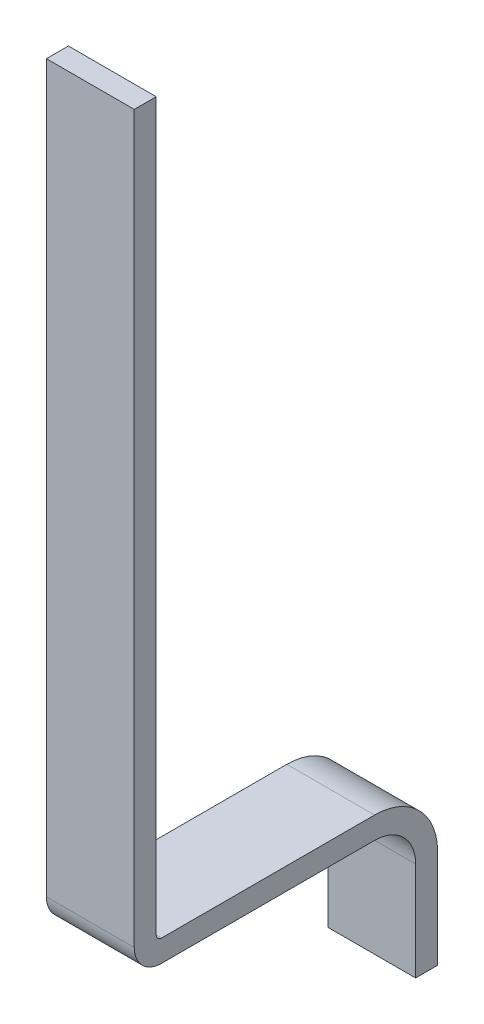
ISO-10303-21;
HEADER;
FILE_DESCRIPTION(('STEP AP214'),'2;1');
FILE_NAME('part.step','',(''),(''),'','','');
FILE_SCHEMA(('AUTOMOTIVE_DESIGN { 1 0 10303 214 1 1 1 1 }'));
ENDSEC;
DATA;
#1=APPLICATION_CONTEXT('core data for automotive mechanical design processes');
#2=APPLICATION_PROTOCOL_DEFINITION('international standard','automotive_design',2000,#1);
#3=PRODUCT_CONTEXT('',#1,'mechanical');
#4=PRODUCT('Part','Part','',(#3));
#5=PRODUCT_RELATED_PRODUCT_CATEGORY('part','',(#4));
#6=PRODUCT_DEFINITION_FORMATION('','',#4);
#7=PRODUCT_DEFINITION_CONTEXT('part definition',#1,'design');
#8=PRODUCT_DEFINITION('design','',#6,#7);
#9=PRODUCT_DEFINITION_SHAPE('','',#8);
#10=(LENGTH_UNIT() NAMED_UNIT(*) SI_UNIT(.MILLI.,.METRE.));
#11=(NAMED_UNIT(*) PLANE_ANGLE_UNIT() SI_UNIT($,.RADIAN.));
#12=(NAMED_UNIT(*) SI_UNIT($,.STERADIAN.) SOLID_ANGLE_UNIT());
#13=UNCERTAINTY_MEASURE_WITH_UNIT(LENGTH_MEASURE(1.E-05),#10,'distance_accuracy_value','');
#14=(GEOMETRIC_REPRESENTATION_CONTEXT(3) GLOBAL_UNCERTAINTY_ASSIGNED_CONTEXT((#13)) GLOBAL_UNIT_ASSIGNED_CONTEXT((#10,
#11,#12)) REPRESENTATION_CONTEXT('',''));
#15=CARTESIAN_POINT('',(0.,0.,0.));
#16=DIRECTION('',(0.,0.,1.));
#17=DIRECTION('',(1.,0.,0.));
#18=AXIS2_PLACEMENT_3D('',#15,#16,#17);
#19=CARTESIAN_POINT('',(0.4,-0.824102749111,-0.09602584583165));
#20=DIRECTION('',(1.,0.,0.));
#21=DIRECTION('',(0.,-1.,0.));
#22=AXIS2_PLACEMENT_3D('',#19,#20,#21);
#23=PLANE('',#22);
#24=DIRECTION('',(0.,1.,0.));
#25=VECTOR('',#24,1.);
#26=CARTESIAN_POINT('',(0.4,-1.805851747482,0.16));
#27=LINE('',#26,#25);
#28=CARTESIAN_POINT('',(0.4,-1.805851747482,0.16));
#29=VERTEX_POINT('',#28);
#30=CARTESIAN_POINT('',(0.4,1.5,0.16));
#31=VERTEX_POINT('',#30);
#32=EDGE_CURVE('E194',#29,#31,#27,.T.);
#33=ORIENTED_EDGE('',*,*,#32,.T.);
#34=DIRECTION('',(0.,0.,1.));
#35=VECTOR('',#34,1.);
#36=CARTESIAN_POINT('',(0.4,1.5,0.16));
#37=LINE('',#36,#35);
#38=CARTESIAN_POINT('',(0.4,1.5,0.26));
#39=VERTEX_POINT('',#38);
#40=EDGE_CURVE('E246',#31,#39,#37,.T.);
#41=ORIENTED_EDGE('',*,*,#40,.T.);
#42=DIRECTION('',(0.,-1.,0.));
#43=VECTOR('',#42,1.);
#44=CARTESIAN_POINT('',(0.4,1.5,0.26));
#45=LINE('',#44,#43);
#46=CARTESIAN_POINT('',(0.4,-1.805851747482,0.26));
#47=VERTEX_POINT('',#46);
#48=EDGE_CURVE('E217',#39,#47,#45,.T.);
#49=ORIENTED_EDGE('',*,*,#48,.T.);
#50=CARTESIAN_POINT('',(0.4,-1.805851747482,0.135287023696));
#51=DIRECTION('',(1.,0.,0.));
#52=DIRECTION('',(0.,1.,0.));
#53=AXIS2_PLACEMENT_3D('',#50,#51,#52);
#54=CIRCLE('',#53,0.124712976304);
#55=CARTESIAN_POINT('',(0.4,-1.930564723786,0.135287023696));
#56=VERTEX_POINT('',#55);
#57=EDGE_CURVE('E242',#47,#56,#54,.T.);
#58=ORIENTED_EDGE('',*,*,#57,.T.);
#59=DIRECTION('',(0.,0.,-1.));
#60=VECTOR('',#59,1.);
#61=CARTESIAN_POINT('',(0.4,-1.930564723786,0.135287023696));
#62=LINE('',#61,#60);
#63=CARTESIAN_POINT('',(0.4,-1.930564723786,-0.834763344159));
#64=VERTEX_POINT('',#63);
#65=EDGE_CURVE('E229',#56,#64,#62,.T.);
#66=ORIENTED_EDGE('',*,*,#65,.T.);
#67=CARTESIAN_POINT('',(0.4,-2.117351316963,-0.834763344159));
#68=DIRECTION('',(1.,0.,0.));
#69=DIRECTION('',(0.,1.,0.));
#70=AXIS2_PLACEMENT_3D('',#67,#68,#69);
#71=CIRCLE('',#70,0.186786593177);
#72=CARTESIAN_POINT('',(0.4,-2.117351316963,-1.021549937336));
#73=VERTEX_POINT('',#72);
#74=EDGE_CURVE('E215',#73,#64,#71,.T.);
#75=ORIENTED_EDGE('',*,*,#74,.F.);
#76=DIRECTION('',(0.,-1.,0.));
#77=VECTOR('',#76,1.);
#78=CARTESIAN_POINT('',(0.4,-2.117351316963,-1.021549937336));
#79=LINE('',#78,#77);
#80=CARTESIAN_POINT('',(0.4,-2.566872544918,-1.021549937336));
#81=VERTEX_POINT('',#80);
#82=EDGE_CURVE('E144',#73,#81,#79,.T.);
#83=ORIENTED_EDGE('',*,*,#82,.T.);
#84=DIRECTION('',(0.,0.,-1.));
#85=VECTOR('',#84,1.);
#86=CARTESIAN_POINT('',(0.4,-2.566872544918,-1.021549937336));
#87=LINE('',#86,#85);
#88=CARTESIAN_POINT('',(0.4,-2.566872544918,-1.121549937336));
#89=VERTEX_POINT('',#88);
#90=EDGE_CURVE('E140',#81,#89,#87,.T.);
#91=ORIENTED_EDGE('',*,*,#90,.T.);
#92=DIRECTION('',(0.,1.,0.));
#93=VECTOR('',#92,1.);
#94=CARTESIAN_POINT('',(0.4,-2.566872544918,-1.121549937336));
#95=LINE('',#94,#93);
#96=CARTESIAN_POINT('',(0.4,-2.117351316963,-1.121549937336));
#97=VERTEX_POINT('',#96);
#98=EDGE_CURVE('E127',#89,#97,#95,.T.);
#99=ORIENTED_EDGE('',*,*,#98,.T.);
#100=CARTESIAN_POINT('',(0.4,-2.117351316963,-0.834763344159));
#101=DIRECTION('',(1.,0.,0.));
#102=DIRECTION('',(0.,1.,0.));
#103=AXIS2_PLACEMENT_3D('',#100,#101,#102);
#104=CIRCLE('',#103,0.286786593177);
#105=CARTESIAN_POINT('',(0.4,-1.830564723786,-0.834763344159));
#106=VERTEX_POINT('',#105);
#107=EDGE_CURVE('E170',#97,#106,#104,.T.);
#108=ORIENTED_EDGE('',*,*,#107,.T.);
#109=DIRECTION('',(0.,0.,1.));
#110=VECTOR('',#109,1.);
#111=CARTESIAN_POINT('',(0.4,-1.830564723786,-0.834763344159));
#112=LINE('',#111,#110);
#113=CARTESIAN_POINT('',(0.4,-1.830564723786,0.135287023696));
#114=VERTEX_POINT('',#113);
#115=EDGE_CURVE('E65',#106,#114,#112,.T.);
#116=ORIENTED_EDGE('',*,*,#115,.T.);
#117=CARTESIAN_POINT('',(0.4,-1.805851747482,0.135287023696));
#118=DIRECTION('',(1.,0.,0.));
#119=DIRECTION('',(0.,1.,0.));
#120=AXIS2_PLACEMENT_3D('',#117,#118,#119);
#121=CIRCLE('',#120,0.02471297630395);
#122=EDGE_CURVE('E11',#29,#114,#121,.T.);
#123=ORIENTED_EDGE('',*,*,#122,.F.);
#124=EDGE_LOOP('',(#33,#41,#49,#58,#66,#75,#83,#91,#99,#108,#116,#123));
#125=FACE_BOUND('',#124,.T.);
#126=ADVANCED_FACE('F17',(#125),#23,.T.);
#127=CARTESIAN_POINT('',(0.,-0.824102749111,-0.09602584583165));
#128=DIRECTION('',(1.,0.,0.));
#129=DIRECTION('',(0.,-1.,0.));
#130=AXIS2_PLACEMENT_3D('',#127,#128,#129);
#131=PLANE('',#130);
#132=DIRECTION('',(0.,1.,0.));
#133=VECTOR('',#132,1.);
#134=CARTESIAN_POINT('',(0.,-1.805851747482,0.16));
#135=LINE('',#134,#133);
#136=CARTESIAN_POINT('',(0.,-1.805851747482,0.16));
#137=VERTEX_POINT('',#136);
#138=CARTESIAN_POINT('',(0.,1.5,0.16));
#139=VERTEX_POINT('',#138);
#140=EDGE_CURVE('E184',#137,#139,#135,.T.);
#141=ORIENTED_EDGE('',*,*,#140,.F.);
#142=CARTESIAN_POINT('',(0.,-1.805851747482,0.135287023696));
#143=DIRECTION('',(1.,0.,0.));
#144=DIRECTION('',(0.,1.,0.));
#145=AXIS2_PLACEMENT_3D('',#142,#143,#144);
#146=CIRCLE('',#145,0.02471297630395);
#147=CARTESIAN_POINT('',(0.,-1.830564723786,0.135287023696));
#148=VERTEX_POINT('',#147);
#149=EDGE_CURVE('E26',#137,#148,#146,.T.);
#150=ORIENTED_EDGE('',*,*,#149,.T.);
#151=DIRECTION('',(0.,0.,1.));
#152=VECTOR('',#151,1.);
#153=CARTESIAN_POINT('',(0.,-1.830564723786,-0.834763344159));
#154=LINE('',#153,#152);
#155=CARTESIAN_POINT('',(0.,-1.830564723786,-0.834763344159));
#156=VERTEX_POINT('',#155);
#157=EDGE_CURVE('E55',#156,#148,#154,.T.);
#158=ORIENTED_EDGE('',*,*,#157,.F.);
#159=CARTESIAN_POINT('',(0.,-2.117351316963,-0.834763344159));
#160=DIRECTION('',(1.,0.,0.));
#161=DIRECTION('',(0.,1.,0.));
#162=AXIS2_PLACEMENT_3D('',#159,#160,#161);
#163=CIRCLE('',#162,0.286786593177);
#164=CARTESIAN_POINT('',(0.,-2.117351316963,-1.121549937336));
#165=VERTEX_POINT('',#164);
#166=EDGE_CURVE('E137',#165,#156,#163,.T.);
#167=ORIENTED_EDGE('',*,*,#166,.F.);
#168=DIRECTION('',(0.,1.,0.));
#169=VECTOR('',#168,1.);
#170=CARTESIAN_POINT('',(0.,-2.566872544918,-1.121549937336));
#171=LINE('',#170,#169);
#172=CARTESIAN_POINT('',(0.,-2.566872544918,-1.121549937336));
#173=VERTEX_POINT('',#172);
#174=EDGE_CURVE('E120',#173,#165,#171,.T.);
#175=ORIENTED_EDGE('',*,*,#174,.F.);
#176=DIRECTION('',(0.,0.,-1.));
#177=VECTOR('',#176,1.);
#178=CARTESIAN_POINT('',(0.,-2.566872544918,-1.021549937336));
#179=LINE('',#178,#177);
#180=CARTESIAN_POINT('',(0.,-2.566872544918,-1.021549937336));
#181=VERTEX_POINT('',#180);
#182=EDGE_CURVE('E151',#181,#173,#179,.T.);
#183=ORIENTED_EDGE('',*,*,#182,.F.);
#184=DIRECTION('',(0.,-1.,0.));
#185=VECTOR('',#184,1.);
#186=CARTESIAN_POINT('',(0.,-2.117351316963,-1.021549937336));
#187=LINE('',#186,#185);
#188=CARTESIAN_POINT('',(0.,-2.117351316963,-1.021549937336));
#189=VERTEX_POINT('',#188);
#190=EDGE_CURVE('E270',#189,#181,#187,.T.);
#191=ORIENTED_EDGE('',*,*,#190,.F.);
#192=CARTESIAN_POINT('',(0.,-2.117351316963,-0.834763344159));
#193=DIRECTION('',(1.,0.,0.));
#194=DIRECTION('',(0.,1.,0.));
#195=AXIS2_PLACEMENT_3D('',#192,#193,#194);
#196=CIRCLE('',#195,0.186786593177);
#197=CARTESIAN_POINT('',(0.,-1.930564723786,-0.834763344159));
#198=VERTEX_POINT('',#197);
#199=EDGE_CURVE('E216',#189,#198,#196,.T.);
#200=ORIENTED_EDGE('',*,*,#199,.T.);
#201=DIRECTION('',(0.,0.,-1.));
#202=VECTOR('',#201,1.);
#203=CARTESIAN_POINT('',(0.,-1.930564723786,0.135287023696));
#204=LINE('',#203,#202);
#205=CARTESIAN_POINT('',(0.,-1.930564723786,0.135287023696));
#206=VERTEX_POINT('',#205);
#207=EDGE_CURVE('E238',#206,#198,#204,.T.);
#208=ORIENTED_EDGE('',*,*,#207,.F.);
#209=CARTESIAN_POINT('',(0.,-1.805851747482,0.135287023696));
#210=DIRECTION('',(1.,0.,0.));
#211=DIRECTION('',(0.,1.,0.));
#212=AXIS2_PLACEMENT_3D('',#209,#210,#211);
#213=CIRCLE('',#212,0.124712976304);
#214=CARTESIAN_POINT('',(0.,-1.805851747482,0.26));
#215=VERTEX_POINT('',#214);
#216=EDGE_CURVE('E220',#215,#206,#213,.T.);
#217=ORIENTED_EDGE('',*,*,#216,.F.);
#218=DIRECTION('',(0.,-1.,0.));
#219=VECTOR('',#218,1.);
#220=CARTESIAN_POINT('',(0.,1.5,0.26));
#221=LINE('',#220,#219);
#222=CARTESIAN_POINT('',(0.,1.5,0.26));
#223=VERTEX_POINT('',#222);
#224=EDGE_CURVE('E227',#223,#215,#221,.T.);
#225=ORIENTED_EDGE('',*,*,#224,.F.);
#226=DIRECTION('',(0.,0.,1.));
#227=VECTOR('',#226,1.);
#228=CARTESIAN_POINT('',(0.,1.5,0.16));
#229=LINE('',#228,#227);
#230=EDGE_CURVE('E203',#139,#223,#229,.T.);
#231=ORIENTED_EDGE('',*,*,#230,.F.);
#232=EDGE_LOOP('',(#141,#150,#158,#167,#175,#183,#191,#200,#208,#217,#225,#231));
#233=FACE_BOUND('',#232,.T.);
#234=ADVANCED_FACE('F181',(#233),#131,.F.);
#235=CARTESIAN_POINT('',(0.,-1.805851747482,0.135287023696));
#236=DIRECTION('',(-1.,0.,0.));
#237=DIRECTION('',(0.,1.,0.));
#238=AXIS2_PLACEMENT_3D('',#235,#236,#237);
#239=CYLINDRICAL_SURFACE('',#238,0.02471297630395);
#240=ORIENTED_EDGE('',*,*,#149,.F.);
#241=DIRECTION('',(1.,0.,0.));
#242=VECTOR('',#241,1.);
#243=CARTESIAN_POINT('',(0.,-1.805851747482,0.16));
#244=LINE('',#243,#242);
#245=EDGE_CURVE('E199',#137,#29,#244,.T.);
#246=ORIENTED_EDGE('',*,*,#245,.T.);
#247=ORIENTED_EDGE('',*,*,#122,.T.);
#248=DIRECTION('',(1.,0.,0.));
#249=VECTOR('',#248,1.);
#250=CARTESIAN_POINT('',(0.,-1.830564723786,0.135287023696));
#251=LINE('',#250,#249);
#252=EDGE_CURVE('E175',#148,#114,#251,.T.);
#253=ORIENTED_EDGE('',*,*,#252,.F.);
#254=EDGE_LOOP('',(#240,#246,#247,#253));
#255=FACE_BOUND('',#254,.T.);
#256=ADVANCED_FACE('F186',(#255),#239,.F.);
#257=CARTESIAN_POINT('',(0.,-1.830564723786,-0.834763344159));
#258=DIRECTION('',(0.,-1.,0.));
#259=DIRECTION('',(-1.,0.,0.));
#260=AXIS2_PLACEMENT_3D('',#257,#258,#259);
#261=PLANE('',#260);
#262=DIRECTION('',(1.,0.,0.));
#263=VECTOR('',#262,1.);
#264=CARTESIAN_POINT('',(0.,-1.830564723786,-0.834763344159));
#265=LINE('',#264,#263);
#266=EDGE_CURVE('E166',#156,#106,#265,.T.);
#267=ORIENTED_EDGE('',*,*,#266,.F.);
#268=ORIENTED_EDGE('',*,*,#157,.T.);
#269=ORIENTED_EDGE('',*,*,#252,.T.);
#270=ORIENTED_EDGE('',*,*,#115,.F.);
#271=EDGE_LOOP('',(#267,#268,#269,#270));
#272=FACE_BOUND('',#271,.T.);
#273=ADVANCED_FACE('F189',(#272),#261,.F.);
#274=CARTESIAN_POINT('',(0.,-2.117351316963,-0.834763344159));
#275=DIRECTION('',(-1.,0.,0.));
#276=DIRECTION('',(0.,1.,0.));
#277=AXIS2_PLACEMENT_3D('',#274,#275,#276);
#278=CYLINDRICAL_SURFACE('',#277,0.286786593177);
#279=DIRECTION('',(1.,0.,0.));
#280=VECTOR('',#279,1.);
#281=CARTESIAN_POINT('',(0.,-2.117351316963,-1.121549937336));
#282=LINE('',#281,#280);
#283=EDGE_CURVE('E134',#165,#97,#282,.T.);
#284=ORIENTED_EDGE('',*,*,#283,.F.);
#285=ORIENTED_EDGE('',*,*,#166,.T.);
#286=ORIENTED_EDGE('',*,*,#266,.T.);
#287=ORIENTED_EDGE('',*,*,#107,.F.);
#288=EDGE_LOOP('',(#284,#285,#286,#287));
#289=FACE_BOUND('',#288,.T.);
#290=ADVANCED_FACE('F191',(#289),#278,.T.);
#291=CARTESIAN_POINT('',(0.,-2.566872544918,-1.121549937336));
#292=DIRECTION('',(0.,0.,1.));
#293=DIRECTION('',(0.,-1.,0.));
#294=AXIS2_PLACEMENT_3D('',#291,#292,#293);
#295=PLANE('',#294);
#296=DIRECTION('',(1.,0.,0.));
#297=VECTOR('',#296,1.);
#298=CARTESIAN_POINT('',(0.,-2.566872544918,-1.121549937336));
#299=LINE('',#298,#297);
#300=EDGE_CURVE('E131',#173,#89,#299,.T.);
#301=ORIENTED_EDGE('',*,*,#300,.F.);
#302=ORIENTED_EDGE('',*,*,#174,.T.);
#303=ORIENTED_EDGE('',*,*,#283,.T.);
#304=ORIENTED_EDGE('',*,*,#98,.F.);
#305=EDGE_LOOP('',(#301,#302,#303,#304));
#306=FACE_BOUND('',#305,.T.);
#307=ADVANCED_FACE('F129',(#306),#295,.F.);
#308=CARTESIAN_POINT('',(0.,-2.566872544918,-1.021549937336));
#309=DIRECTION('',(0.,1.,0.));
#310=DIRECTION('',(1.,0.,0.));
#311=AXIS2_PLACEMENT_3D('',#308,#309,#310);
#312=PLANE('',#311);
#313=DIRECTION('',(1.,0.,0.));
#314=VECTOR('',#313,1.);
#315=CARTESIAN_POINT('',(0.,-2.566872544918,-1.021549937336));
#316=LINE('',#315,#314);
#317=EDGE_CURVE('E275',#181,#81,#316,.T.);
#318=ORIENTED_EDGE('',*,*,#317,.F.);
#319=ORIENTED_EDGE('',*,*,#182,.T.);
#320=ORIENTED_EDGE('',*,*,#300,.T.);
#321=ORIENTED_EDGE('',*,*,#90,.F.);
#322=EDGE_LOOP('',(#318,#319,#320,#321));
#323=FACE_BOUND('',#322,.T.);
#324=ADVANCED_FACE('F150',(#323),#312,.F.);
#325=CARTESIAN_POINT('',(0.,-2.117351316963,-1.021549937336));
#326=DIRECTION('',(0.,0.,-1.));
#327=DIRECTION('',(0.,-1.,0.));
#328=AXIS2_PLACEMENT_3D('',#325,#326,#327);
#329=PLANE('',#328);
#330=DIRECTION('',(1.,0.,0.));
#331=VECTOR('',#330,1.);
#332=CARTESIAN_POINT('',(0.,-2.117351316963,-1.021549937336));
#333=LINE('',#332,#331);
#334=EDGE_CURVE('E212',#189,#73,#333,.T.);
#335=ORIENTED_EDGE('',*,*,#334,.F.);
#336=ORIENTED_EDGE('',*,*,#190,.T.);
#337=ORIENTED_EDGE('',*,*,#317,.T.);
#338=ORIENTED_EDGE('',*,*,#82,.F.);
#339=EDGE_LOOP('',(#335,#336,#337,#338));
#340=FACE_BOUND('',#339,.T.);
#341=ADVANCED_FACE('F305',(#340),#329,.F.);
#342=CARTESIAN_POINT('',(0.,-2.117351316963,-0.834763344159));
#343=DIRECTION('',(-1.,0.,0.));
#344=DIRECTION('',(0.,1.,0.));
#345=AXIS2_PLACEMENT_3D('',#342,#343,#344);
#346=CYLINDRICAL_SURFACE('',#345,0.186786593177);
#347=ORIENTED_EDGE('',*,*,#199,.F.);
#348=ORIENTED_EDGE('',*,*,#334,.T.);
#349=ORIENTED_EDGE('',*,*,#74,.T.);
#350=DIRECTION('',(1.,0.,0.));
#351=VECTOR('',#350,1.);
#352=CARTESIAN_POINT('',(0.,-1.930564723786,-0.834763344159));
#353=LINE('',#352,#351);
#354=EDGE_CURVE('E233',#198,#64,#353,.T.);
#355=ORIENTED_EDGE('',*,*,#354,.F.);
#356=EDGE_LOOP('',(#347,#348,#349,#355));
#357=FACE_BOUND('',#356,.T.);
#358=ADVANCED_FACE('F313',(#357),#346,.F.);
#359=CARTESIAN_POINT('',(0.,-1.930564723786,0.135287023696));
#360=DIRECTION('',(0.,1.,0.));
#361=DIRECTION('',(1.,0.,0.));
#362=AXIS2_PLACEMENT_3D('',#359,#360,#361);
#363=PLANE('',#362);
#364=DIRECTION('',(1.,0.,0.));
#365=VECTOR('',#364,1.);
#366=CARTESIAN_POINT('',(0.,-1.930564723786,0.135287023696));
#367=LINE('',#366,#365);
#368=EDGE_CURVE('E250',#206,#56,#367,.T.);
#369=ORIENTED_EDGE('',*,*,#368,.F.);
#370=ORIENTED_EDGE('',*,*,#207,.T.);
#371=ORIENTED_EDGE('',*,*,#354,.T.);
#372=ORIENTED_EDGE('',*,*,#65,.F.);
#373=EDGE_LOOP('',(#369,#370,#371,#372));
#374=FACE_BOUND('',#373,.T.);
#375=ADVANCED_FACE('F315',(#374),#363,.F.);
#376=CARTESIAN_POINT('',(0.,-1.805851747482,0.135287023696));
#377=DIRECTION('',(-1.,0.,0.));
#378=DIRECTION('',(0.,1.,0.));
#379=AXIS2_PLACEMENT_3D('',#376,#377,#378);
#380=CYLINDRICAL_SURFACE('',#379,0.124712976304);
#381=DIRECTION('',(1.,0.,0.));
#382=VECTOR('',#381,1.);
#383=CARTESIAN_POINT('',(0.,-1.805851747482,0.26));
#384=LINE('',#383,#382);
#385=EDGE_CURVE('E221',#215,#47,#384,.T.);
#386=ORIENTED_EDGE('',*,*,#385,.F.);
#387=ORIENTED_EDGE('',*,*,#216,.T.);
#388=ORIENTED_EDGE('',*,*,#368,.T.);
#389=ORIENTED_EDGE('',*,*,#57,.F.);
#390=EDGE_LOOP('',(#386,#387,#388,#389));
#391=FACE_BOUND('',#390,.T.);
#392=ADVANCED_FACE('F318',(#391),#380,.T.);
#393=CARTESIAN_POINT('',(0.,1.5,0.26));
#394=DIRECTION('',(0.,0.,-1.));
#395=DIRECTION('',(0.,-1.,0.));
#396=AXIS2_PLACEMENT_3D('',#393,#394,#395);
#397=PLANE('',#396);
#398=DIRECTION('',(1.,0.,0.));
#399=VECTOR('',#398,1.);
#400=CARTESIAN_POINT('',(0.,1.5,0.26));
#401=LINE('',#400,#399);
#402=EDGE_CURVE('E237',#223,#39,#401,.T.);
#403=ORIENTED_EDGE('',*,*,#402,.F.);
#404=ORIENTED_EDGE('',*,*,#224,.T.);
#405=ORIENTED_EDGE('',*,*,#385,.T.);
#406=ORIENTED_EDGE('',*,*,#48,.F.);
#407=EDGE_LOOP('',(#403,#404,#405,#406));
#408=FACE_BOUND('',#407,.T.);
#409=ADVANCED_FACE('F394',(#408),#397,.F.);
#410=CARTESIAN_POINT('',(0.,1.5,0.16));
#411=DIRECTION('',(0.,-1.,0.));
#412=DIRECTION('',(-1.,0.,0.));
#413=AXIS2_PLACEMENT_3D('',#410,#411,#412);
#414=PLANE('',#413);
#415=DIRECTION('',(1.,0.,0.));
#416=VECTOR('',#415,1.);
#417=CARTESIAN_POINT('',(0.,1.5,0.16));
#418=LINE('',#417,#416);
#419=EDGE_CURVE('E201',#139,#31,#418,.T.);
#420=ORIENTED_EDGE('',*,*,#419,.F.);
#421=ORIENTED_EDGE('',*,*,#230,.T.);
#422=ORIENTED_EDGE('',*,*,#402,.T.);
#423=ORIENTED_EDGE('',*,*,#40,.F.);
#424=EDGE_LOOP('',(#420,#421,#422,#423));
#425=FACE_BOUND('',#424,.T.);
#426=ADVANCED_FACE('F402',(#425),#414,.F.);
#427=CARTESIAN_POINT('',(0.,-1.805851747482,0.16));
#428=DIRECTION('',(0.,0.,1.));
#429=DIRECTION('',(0.,-1.,0.));
#430=AXIS2_PLACEMENT_3D('',#427,#428,#429);
#431=PLANE('',#430);
#432=ORIENTED_EDGE('',*,*,#245,.F.);
#433=ORIENTED_EDGE('',*,*,#140,.T.);
#434=ORIENTED_EDGE('',*,*,#419,.T.);
#435=ORIENTED_EDGE('',*,*,#32,.F.);
#436=EDGE_LOOP('',(#432,#433,#434,#435));
#437=FACE_BOUND('',#436,.T.);
#438=ADVANCED_FACE('F198',(#437),#431,.F.);
#439=CLOSED_SHELL('',(#126,#234,#256,#273,#290,#307,#324,#341,#358,#375,#392,#409,#426,#438));
#440=MANIFOLD_SOLID_BREP('B1',#439);
#441=ADVANCED_BREP_SHAPE_REPRESENTATION('',(#18,#440),#14);
#442=SHAPE_DEFINITION_REPRESENTATION(#9,#441);
ENDSEC;
END-ISO-10303-21;
